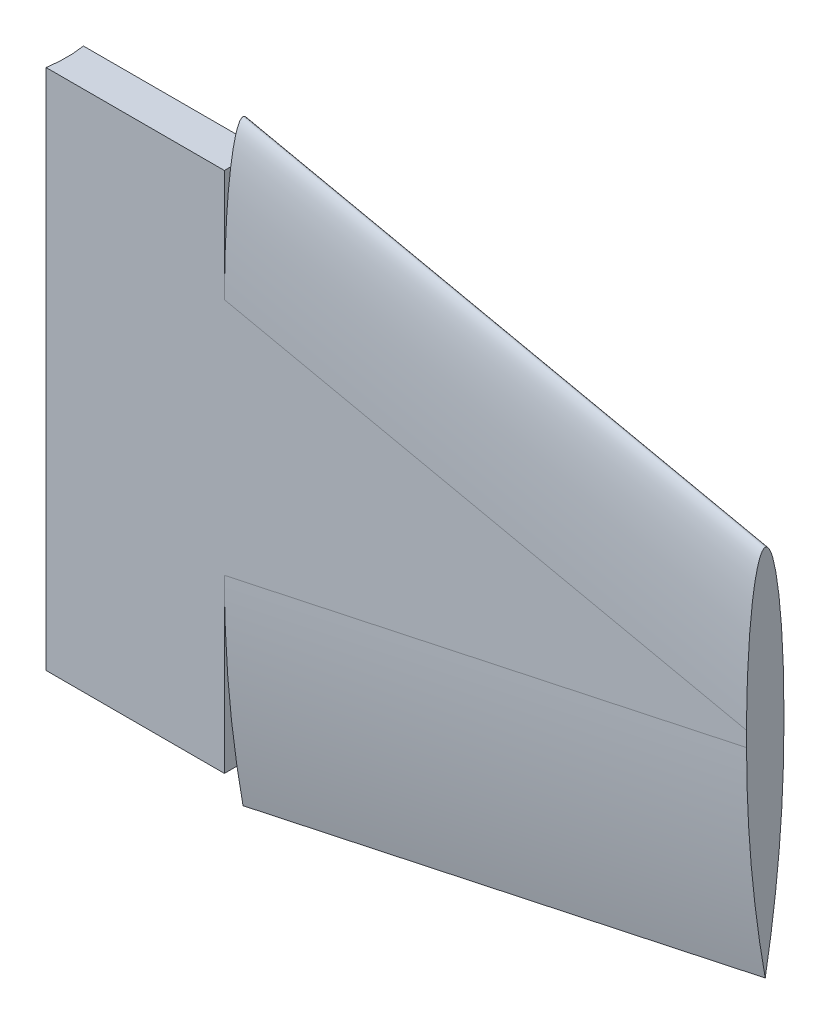
ISO-10303-21;
HEADER;
FILE_DESCRIPTION(('STEP AP214'),'2;1');
FILE_NAME('part.step','',(''),(''),'','','');
FILE_SCHEMA(('AUTOMOTIVE_DESIGN { 1 0 10303 214 1 1 1 1 }'));
ENDSEC;
DATA;
#1=APPLICATION_CONTEXT('core data for automotive mechanical design processes');
#2=APPLICATION_PROTOCOL_DEFINITION('international standard','automotive_design',2000,#1);
#3=PRODUCT_CONTEXT('',#1,'mechanical');
#4=PRODUCT('Part','Part','',(#3));
#5=PRODUCT_RELATED_PRODUCT_CATEGORY('part','',(#4));
#6=PRODUCT_DEFINITION_FORMATION('','',#4);
#7=PRODUCT_DEFINITION_CONTEXT('part definition',#1,'design');
#8=PRODUCT_DEFINITION('design','',#6,#7);
#9=PRODUCT_DEFINITION_SHAPE('','',#8);
#10=(LENGTH_UNIT() NAMED_UNIT(*) SI_UNIT(.MILLI.,.METRE.));
#11=(NAMED_UNIT(*) PLANE_ANGLE_UNIT() SI_UNIT($,.RADIAN.));
#12=(NAMED_UNIT(*) SI_UNIT($,.STERADIAN.) SOLID_ANGLE_UNIT());
#13=UNCERTAINTY_MEASURE_WITH_UNIT(LENGTH_MEASURE(1.E-05),#10,'distance_accuracy_value','');
#14=(GEOMETRIC_REPRESENTATION_CONTEXT(3) GLOBAL_UNCERTAINTY_ASSIGNED_CONTEXT((#13)) GLOBAL_UNIT_ASSIGNED_CONTEXT((#10,
#11,#12)) REPRESENTATION_CONTEXT('',''));
#15=CARTESIAN_POINT('',(0.,0.,0.));
#16=DIRECTION('',(0.,0.,1.));
#17=DIRECTION('',(1.,0.,0.));
#18=AXIS2_PLACEMENT_3D('',#15,#16,#17);
#19=CARTESIAN_POINT('',(95.,60.,5.));
#20=DIRECTION('',(-1.,0.,0.));
#21=DIRECTION('',(0.,0.,1.));
#22=AXIS2_PLACEMENT_3D('',#19,#20,#21);
#23=PLANE('',#22);
#24=CARTESIAN_POINT('',(95.,38.,-153.05));
#25=DIRECTION('',(1.,0.,0.));
#26=DIRECTION('',(0.,1.,0.));
#27=AXIS2_PLACEMENT_3D('',#24,#25,#26);
#28=CIRCLE('',#27,158.05);
#29=CARTESIAN_POINT('',(95.,38.,5.));
#30=VERTEX_POINT('',#29);
#31=CARTESIAN_POINT('',(95.,10.,2.5));
#32=VERTEX_POINT('',#31);
#33=EDGE_CURVE('E240',#30,#32,#28,.T.);
#34=ORIENTED_EDGE('',*,*,#33,.T.);
#35=CARTESIAN_POINT('',(95.,38.,158.05));
#36=DIRECTION('',(1.,0.,0.));
#37=DIRECTION('',(0.,1.,0.));
#38=AXIS2_PLACEMENT_3D('',#35,#36,#37);
#39=CIRCLE('',#38,158.05);
#40=CARTESIAN_POINT('',(95.,38.,0.));
#41=VERTEX_POINT('',#40);
#42=EDGE_CURVE('E152',#41,#32,#39,.F.);
#43=ORIENTED_EDGE('',*,*,#42,.F.);
#44=DIRECTION('',(0.,1.,0.));
#45=VECTOR('',#44,1.);
#46=CARTESIAN_POINT('',(95.,60.,0.));
#47=LINE('',#46,#45);
#48=CARTESIAN_POINT('',(95.,40.,0.));
#49=VERTEX_POINT('',#48);
#50=EDGE_CURVE('E160',#41,#49,#47,.T.);
#51=ORIENTED_EDGE('',*,*,#50,.T.);
#52=CARTESIAN_POINT('',(95.,40.,2.5));
#53=DIRECTION('',(1.,0.,0.));
#54=DIRECTION('',(0.,1.,0.));
#55=AXIS2_PLACEMENT_3D('',#52,#53,#54);
#56=ELLIPSE('',#55,20.,2.5);
#57=CARTESIAN_POINT('',(95.,40.,5.));
#58=VERTEX_POINT('',#57);
#59=EDGE_CURVE('E222',#49,#58,#56,.T.);
#60=ORIENTED_EDGE('',*,*,#59,.T.);
#61=DIRECTION('',(0.,1.,0.));
#62=VECTOR('',#61,1.);
#63=CARTESIAN_POINT('',(95.,60.,5.));
#64=LINE('',#63,#62);
#65=EDGE_CURVE('E162',#30,#58,#64,.T.);
#66=ORIENTED_EDGE('',*,*,#65,.F.);
#67=EDGE_LOOP('',(#34,#43,#51,#60,#66));
#68=FACE_BOUND('',#67,.T.);
#69=ADVANCED_FACE('F52',(#68),#23,.F.);
#70=CARTESIAN_POINT('',(25.,-5.,5.));
#71=DIRECTION('',(1.,0.,0.));
#72=DIRECTION('',(0.,1.,0.));
#73=AXIS2_PLACEMENT_3D('',#70,#71,#72);
#74=PLANE('',#73);
#75=DIRECTION('',(0.,0.,-1.));
#76=VECTOR('',#75,1.);
#77=CARTESIAN_POINT('',(25.,0.,5.));
#78=LINE('',#77,#76);
#79=CARTESIAN_POINT('',(25.,0.,3.31752380209902));
#80=VERTEX_POINT('',#79);
#81=CARTESIAN_POINT('',(25.,-2.79117007284668E-12,1.68247619790141));
#82=VERTEX_POINT('',#81);
#83=EDGE_CURVE('E60',#80,#82,#78,.T.);
#84=ORIENTED_EDGE('',*,*,#83,.T.);
#85=CARTESIAN_POINT('',(25.,-5.,2.5));
#86=CARTESIAN_POINT('',(25.,-4.22891004803133,2.36119838188935));
#87=CARTESIAN_POINT('',(25.,-3.45678786190338,2.22813131429508));
#88=CARTESIAN_POINT('',(25.,-1.91150037104142,1.97363373583211));
#89=CARTESIAN_POINT('',(25.,-1.13833714759861,1.85219058744662));
#90=CARTESIAN_POINT('',(25.,0.409027347301473,1.62090461061019));
#91=CARTESIAN_POINT('',(25.,1.18322710807492,1.51105167521599));
#92=CARTESIAN_POINT('',(25.,2.73266060465429,1.30291688823553));
#93=CARTESIAN_POINT('',(25.,3.50789332172647,1.20462745276201));
#94=CARTESIAN_POINT('',(25.,5.05938978757526,1.01959822513703));
#95=CARTESIAN_POINT('',(25.,5.83565293240375,0.932853368772302));
#96=CARTESIAN_POINT('',(25.,7.38920839583698,0.770899380919737));
#97=CARTESIAN_POINT('',(25.,8.16650044936275,0.695687706635616));
#98=CARTESIAN_POINT('',(25.,9.72211395689603,0.556793643463008));
#99=CARTESIAN_POINT('',(25.,10.5004354109035,0.493111254574523));
#100=CARTESIAN_POINT('',(25.,12.0581087041456,0.377276960581072));
#101=CARTESIAN_POINT('',(25.,12.8374607329737,0.325127605012163));
#102=CARTESIAN_POINT('',(25.,14.3971955867306,0.232368321958052));
#103=CARTESIAN_POINT('',(25.,15.177578714436,0.191763485576444));
#104=CARTESIAN_POINT('',(25.,16.7393765912369,0.12210975707657));
#105=CARTESIAN_POINT('',(25.,17.5207916812675,0.0930685093632958));
#106=CARTESIAN_POINT('',(25.,19.0846547279814,0.0465663128413747));
#107=CARTESIAN_POINT('',(25.,19.8671029884137,0.0291155787380201));
#108=CARTESIAN_POINT('',(25.,21.4330340317578,0.00582578807542668));
#109=CARTESIAN_POINT('',(25.,22.2165170051513,-4.62144755699006E-07));
#110=CARTESIAN_POINT('',(25.,23.,0.));
#111=B_SPLINE_CURVE_WITH_KNOTS('',3,(#85,#86,#87,#88,#89,#90,#91,#92,#93,#94,#95,#96,#97,#98,
#99,#100,#101,#102,#103,#104,#105,#106,#107,#108,#109,#110),.UNSPECIFIED.,.F.,.F.,(4,2,2,2,2,2,
2,2,2,2,2,2,4),(0.,2.35042727790173,4.69826943481805,7.04404699433685,9.38827740331911,
11.7314760648126,14.0741573608249,16.4168386568372,18.7600373183307,21.104267727313,
23.4500452868318,25.7978874437481,28.1483147216498),.UNSPECIFIED.);
#112=CARTESIAN_POINT('',(25.,-5.,2.5));
#113=VERTEX_POINT('',#112);
#114=EDGE_CURVE('E247',#113,#82,#111,.T.);
#115=ORIENTED_EDGE('',*,*,#114,.F.);
#116=CARTESIAN_POINT('',(25.,-4.99999999999999,2.5));
#117=CARTESIAN_POINT('',(25.,-4.22891004803133,2.63880161811067));
#118=CARTESIAN_POINT('',(25.,-3.45678786190338,2.77186868570494));
#119=CARTESIAN_POINT('',(25.,-1.91150037104141,3.02636626416792));
#120=CARTESIAN_POINT('',(25.,-1.1383371475986,3.14780941255339));
#121=CARTESIAN_POINT('',(25.,0.409027347301485,3.37909538938981));
#122=CARTESIAN_POINT('',(25.,1.18322710807493,3.48894832478401));
#123=CARTESIAN_POINT('',(25.,2.73266060465431,3.69708311176447));
#124=CARTESIAN_POINT('',(25.,3.50789332172649,3.795372547238));
#125=CARTESIAN_POINT('',(25.,5.05938978757527,3.98040177486297));
#126=CARTESIAN_POINT('',(25.,5.83565293240377,4.0671466312277));
#127=CARTESIAN_POINT('',(25.,7.389208395837,4.22910061908027));
#128=CARTESIAN_POINT('',(25.,8.16650044936276,4.30431229336439));
#129=CARTESIAN_POINT('',(25.,9.72211395689605,4.443206356537));
#130=CARTESIAN_POINT('',(25.,10.5004354109036,4.50688874542548));
#131=CARTESIAN_POINT('',(25.,12.0581087041456,4.62272303941892));
#132=CARTESIAN_POINT('',(25.,12.8374607329738,4.67487239498784));
#133=CARTESIAN_POINT('',(25.,14.3971955867307,4.76763167804195));
#134=CARTESIAN_POINT('',(25.,15.1775787144361,4.80823651442356));
#135=CARTESIAN_POINT('',(25.,16.7393765912369,4.87789024292343));
#136=CARTESIAN_POINT('',(25.,17.5207916812676,4.90693149063671));
#137=CARTESIAN_POINT('',(25.,19.0846547279815,4.95343368715863));
#138=CARTESIAN_POINT('',(25.,19.8671029884137,4.97088442126198));
#139=CARTESIAN_POINT('',(25.,21.4330340317579,4.99417421192458));
#140=CARTESIAN_POINT('',(25.,22.2165170051514,5.00000046214476));
#141=CARTESIAN_POINT('',(25.,23.,5.));
#142=B_SPLINE_CURVE_WITH_KNOTS('',3,(#116,#117,#118,#119,#120,#121,#122,#123,#124,#125,#126,
#127,#128,#129,#130,#131,#132,#133,#134,#135,#136,#137,#138,#139,#140,#141),.UNSPECIFIED.,.F.,
.F.,(4,2,2,2,2,2,2,2,2,2,2,2,4),(0.,2.35042727790174,4.69826943481806,7.04404699433686,
9.38827740331912,11.7314760648126,14.0741573608249,16.4168386568373,18.7600373183308,
21.104267727313,23.4500452868318,25.7978874437481,28.1483147216499),.UNSPECIFIED.);
#143=EDGE_CURVE('E254',#113,#80,#142,.T.);
#144=ORIENTED_EDGE('',*,*,#143,.T.);
#145=EDGE_LOOP('',(#84,#115,#144));
#146=FACE_BOUND('',#145,.T.);
#147=ADVANCED_FACE('F296',(#146),#74,.F.);
#148=CARTESIAN_POINT('',(25.,70.,5.));
#149=DIRECTION('',(1.,0.,0.));
#150=DIRECTION('',(0.,1.,0.));
#151=AXIS2_PLACEMENT_3D('',#148,#149,#150);
#152=PLANE('',#151);
#153=CARTESIAN_POINT('',(25.,55.,5.));
#154=CARTESIAN_POINT('',(25.,55.6100570971112,4.99996719193825));
#155=CARTESIAN_POINT('',(25.,56.2201167969391,4.99650921176124));
#156=CARTESIAN_POINT('',(25.,57.440177884873,4.98251278536062));
#157=CARTESIAN_POINT('',(25.,58.0501792698518,4.97197406802728));
#158=CARTESIAN_POINT('',(25.,59.2700169296486,4.94358593248582));
#159=CARTESIAN_POINT('',(25.,59.8798532035131,4.92573647291487));
#160=CARTESIAN_POINT('',(25.,61.0992400519951,4.88223137885396));
#161=CARTESIAN_POINT('',(25.,61.7087906312321,4.85657587527583));
#162=CARTESIAN_POINT('',(25.,62.9274974345676,4.79668083316584));
#163=CARTESIAN_POINT('',(25.,63.5366536417813,4.76244094869547));
#164=CARTESIAN_POINT('',(25.,64.7543779009708,4.68418376354576));
#165=CARTESIAN_POINT('',(25.,65.3629459265278,4.64016604247418));
#166=CARTESIAN_POINT('',(25.,66.2751443151161,4.56534893535719));
#167=CARTESIAN_POINT('',(25.,66.5791371528876,4.5389411956029));
#168=CARTESIAN_POINT('',(25.,67.1868177684382,4.48283427261292));
#169=CARTESIAN_POINT('',(25.,67.490505549517,4.45313512537478));
#170=CARTESIAN_POINT('',(25.,68.0974751439356,4.38999031987914));
#171=CARTESIAN_POINT('',(25.,68.4007569801746,4.35654488281176));
#172=CARTESIAN_POINT('',(25.,69.0068031091154,4.28528168916124));
#173=CARTESIAN_POINT('',(25.,69.3095674143278,4.247464039831));
#174=CARTESIAN_POINT('',(25.,69.9143854270388,4.16657082634898));
#175=CARTESIAN_POINT('',(25.,70.2164391615704,4.12349546562979));
#176=CARTESIAN_POINT('',(25.,70.8195541482979,4.03078515573143));
#177=CARTESIAN_POINT('',(25.,71.1206154080616,3.98115025668839));
#178=CARTESIAN_POINT('',(25.,71.6292555066511,3.88969609331526));
#179=CARTESIAN_POINT('',(25.,71.8372391715174,3.85013549817384));
#180=CARTESIAN_POINT('',(25.,72.252115932454,3.76566943397312));
#181=CARTESIAN_POINT('',(25.,72.4590091400108,3.72076452282831));
#182=CARTESIAN_POINT('',(25.,72.8053286027722,3.63921009637234));
#183=CARTESIAN_POINT('',(25.,72.945210310305,3.60450073734025));
#184=CARTESIAN_POINT('',(25.,73.2238732607419,3.53075903127375));
#185=CARTESIAN_POINT('',(25.,73.3626543328855,3.49172602697326));
#186=CARTESIAN_POINT('',(25.,73.5950513088215,3.42098403316814));
#187=CARTESIAN_POINT('',(25.,73.6891402170798,3.3908342740368));
#188=CARTESIAN_POINT('',(25.,73.8760519872633,3.32697835155567));
#189=CARTESIAN_POINT('',(25.,73.9688756989491,3.29327472304237));
#190=CARTESIAN_POINT('',(25.,74.1242844265109,3.23213593096584));
#191=CARTESIAN_POINT('',(25.,74.1873679674086,3.20597237707307));
#192=CARTESIAN_POINT('',(25.,74.3123320746899,3.15056905671851));
#193=CARTESIAN_POINT('',(25.,74.3742103112245,3.12132392115857));
#194=CARTESIAN_POINT('',(25.,74.4665222964685,3.07380484075676));
#195=CARTESIAN_POINT('',(25.,74.4977319733232,3.0570398855988));
#196=CARTESIAN_POINT('',(25.,74.5593926874627,3.02217433373097));
#197=CARTESIAN_POINT('',(25.,74.5898439092831,3.00407406624021));
#198=CARTESIAN_POINT('',(25.,74.6496370712184,2.96629258884342));
#199=CARTESIAN_POINT('',(25.,74.6789819099014,2.946616003685));
#200=CARTESIAN_POINT('',(25.,74.7362031304988,2.90524948704028));
#201=CARTESIAN_POINT('',(25.,74.7640807817225,2.88356134223557));
#202=CARTESIAN_POINT('',(25.,74.8126876805361,2.84187598113215));
#203=CARTESIAN_POINT('',(25.,74.8337837350528,2.82231128263778));
#204=CARTESIAN_POINT('',(25.,74.8739175922178,2.78104463735637));
#205=CARTESIAN_POINT('',(25.,74.8929506154655,2.75933794129225));
#206=CARTESIAN_POINT('',(25.,74.928134059523,2.71304349190787));
#207=CARTESIAN_POINT('',(25.,74.9442291833767,2.68841255456384));
#208=CARTESIAN_POINT('',(25.,74.9712354824057,2.63648383059207));
#209=CARTESIAN_POINT('',(25.,74.9821791655262,2.60920411465042));
#210=CARTESIAN_POINT('',(25.,74.9929300516406,2.56778343170071));
#211=CARTESIAN_POINT('',(25.,74.9955649118799,2.55436155683121));
#212=CARTESIAN_POINT('',(25.,74.999100468482,2.52729522636453));
#213=CARTESIAN_POINT('',(25.,75.0000021567772,2.51365090259217));
#214=CARTESIAN_POINT('',(25.,74.9999968806356,2.48025658801789));
#215=CARTESIAN_POINT('',(25.,74.9981030915235,2.46049941441228));
#216=CARTESIAN_POINT('',(25.,74.990783777299,2.42164689206323));
#217=CARTESIAN_POINT('',(25.,74.9853519467445,2.40255278915042));
#218=CARTESIAN_POINT('',(25.,74.9695541841972,2.3600333765652));
#219=CARTESIAN_POINT('',(25.,74.9582088307706,2.33697841679715));
#220=CARTESIAN_POINT('',(25.,74.9320668340334,2.29293062362906));
#221=CARTESIAN_POINT('',(25.,74.9172621912404,2.27194273264098));
#222=CARTESIAN_POINT('',(25.,74.8866034518594,2.23351738531976));
#223=CARTESIAN_POINT('',(25.,74.8709332505069,2.2159299743133));
#224=CARTESIAN_POINT('',(25.,74.8381525456892,2.18213946944723));
#225=CARTESIAN_POINT('',(25.,74.8210407187674,2.16593767573262));
#226=CARTESIAN_POINT('',(25.,74.7857257489314,2.13468704455279));
#227=CARTESIAN_POINT('',(25.,74.7675198883216,2.11964130929964));
#228=CARTESIAN_POINT('',(25.,74.7303247670051,2.09057759353092));
#229=CARTESIAN_POINT('',(25.,74.7113358475713,2.07655917253632));
#230=CARTESIAN_POINT('',(25.,74.6591092214754,2.03978483535939));
#231=CARTESIAN_POINT('',(25.,74.6252885383343,2.01785800890264));
#232=CARTESIAN_POINT('',(25.,74.556441653079,1.97597336895366));
#233=CARTESIAN_POINT('',(25.,74.5214147164047,1.95601678491646));
#234=CARTESIAN_POINT('',(25.,74.414932069478,1.89843004262513));
#235=CARTESIAN_POINT('',(25.,74.3422004514531,1.86316613886509));
#236=CARTESIAN_POINT('',(25.,74.1945107122808,1.79681353447809));
#237=CARTESIAN_POINT('',(25.,74.1195438123434,1.76574500578123));
#238=CARTESIAN_POINT('',(25.,73.9684528896012,1.70687719886343));
#239=CARTESIAN_POINT('',(25.,73.8923304170447,1.67907391419392));
#240=CARTESIAN_POINT('',(25.,73.7252263712684,1.62110475736306));
#241=CARTESIAN_POINT('',(25.,73.6340736081855,1.59143689059189));
#242=CARTESIAN_POINT('',(25.,73.4509265184294,1.53480199551869));
#243=CARTESIAN_POINT('',(25.,73.3589320735797,1.50783535303636));
#244=CARTESIAN_POINT('',(25.,73.1742609958387,1.45606158229226));
#245=CARTESIAN_POINT('',(25.,73.0815838732991,1.43125621033313));
#246=CARTESIAN_POINT('',(25.,72.8957620698813,1.38345712771971));
#247=CARTESIAN_POINT('',(25.,72.8026173686588,1.36046349663377));
#248=CARTESIAN_POINT('',(25.,72.5232538174978,1.29391766084962));
#249=CARTESIAN_POINT('',(25.,72.3364943080006,1.25263367256103));
#250=CARTESIAN_POINT('',(25.,71.9621084352356,1.17465542010939));
#251=CARTESIAN_POINT('',(25.,71.7744824226245,1.13795944366916));
#252=CARTESIAN_POINT('',(25.,71.3991364462781,1.06832268138205));
#253=CARTESIAN_POINT('',(25.,71.2114185559125,1.0353706660754));
#254=CARTESIAN_POINT('',(25.,70.8354677152791,0.972459656412377));
#255=CARTESIAN_POINT('',(25.,70.6472347180998,0.942500944657877));
#256=CARTESIAN_POINT('',(25.,70.0818113359135,0.856386535700733));
#257=CARTESIAN_POINT('',(25.,69.7040432380805,0.804018940098117));
#258=CARTESIAN_POINT('',(25.,68.9476066160576,0.706973856030569));
#259=CARTESIAN_POINT('',(25.,68.5689382560225,0.662295060531573));
#260=CARTESIAN_POINT('',(25.,67.8109065112351,0.579165100712073));
#261=CARTESIAN_POINT('',(25.,67.4315430975502,0.540714201879654));
#262=CARTESIAN_POINT('',(25.,66.6723497244796,0.469058770475003));
#263=CARTESIAN_POINT('',(25.,66.2925197961621,0.435853905800114));
#264=CARTESIAN_POINT('',(25.,65.5324884609669,0.373999515293144));
#265=CARTESIAN_POINT('',(25.,65.1522870511175,0.345350026207685));
#266=CARTESIAN_POINT('',(25.,64.3657306905758,0.290291724254048));
#267=CARTESIAN_POINT('',(25.,63.9593558641587,0.264167875958922));
#268=CARTESIAN_POINT('',(25.,63.1463598873753,0.216093316902252));
#269=CARTESIAN_POINT('',(25.,62.7397387358153,0.194142626530254));
#270=CARTESIAN_POINT('',(25.,61.519609417156,0.134026895747251));
#271=CARTESIAN_POINT('',(25.,60.705814861066,0.101596797182248));
#272=CARTESIAN_POINT('',(25.,59.0767549229191,0.050237753241242));
#273=CARTESIAN_POINT('',(25.,58.261489001157,0.0313263518014411));
#274=CARTESIAN_POINT('',(25.,57.0384736275857,0.0124907634284814));
#275=CARTESIAN_POINT('',(25.,56.6307923981601,0.00780081775834986));
#276=CARTESIAN_POINT('',(25.,55.8154078894044,0.00155777782920903));
#277=CARTESIAN_POINT('',(25.,55.4077046101936,4.66803686648456E-06));
#278=CARTESIAN_POINT('',(25.,55.,0.));
#279=B_SPLINE_CURVE_WITH_KNOTS('',3,(#153,#154,#155,#156,#157,#158,#159,#160,#161,#162,#163,
#164,#165,#166,#167,#168,#169,#170,#171,#172,#173,#174,#175,#176,#177,#178,#179,#180,#181,#182,
#183,#184,#185,#186,#187,#188,#189,#190,#191,#192,#193,#194,#195,#196,#197,#198,#199,#200,#201,
#202,#203,#204,#205,#206,#207,#208,#209,#210,#211,#212,#213,#214,#215,#216,#217,#218,#219,#220,
#221,#222,#223,#224,#225,#226,#227,#228,#229,#230,#231,#232,#233,#234,#235,#236,#237,#238,#239,
#240,#241,#242,#243,#244,#245,#246,#247,#248,#249,#250,#251,#252,#253,#254,#255,#256,#257,#258,
#259,#260,#261,#262,#263,#264,#265,#266,#267,#268,#269,#270,#271,#272,#273,#274,#275,#276,#277,
#278),.UNSPECIFIED.,.F.,.F.,(4,2,2,2,2,2,2,2,2,2,2,2,2,2,2,2,2,2,2,2,2,2,2,2,2,2,2,2,2,2,2,2,2,
2,2,2,2,2,2,2,2,2,2,2,2,2,2,2,2,2,2,2,2,2,2,2,2,2,2,2,2,2,4),(0.,1.83016571856656,
3.66040151515534,5.49064766702708,7.32086312631316,9.15115235257369,10.9815202862609,
11.8969192109733,12.8123081251116,13.7276430209046,14.6429554677655,15.5582325103663,
16.47350255769,17.1085928962422,17.7436169932387,18.1759420734702,18.6083329647421,
18.9046900277927,19.2008371227083,19.405668093431,19.6108620385447,19.7171196638381,
19.8233511784781,19.9292816971472,20.035119012514,20.1213253285565,20.2077272714266,
20.2956174149738,20.3829452393978,20.4238802008911,20.464791727422,20.5239624025962,
20.5832388204253,20.6598848176106,20.7367098413443,20.8072729908397,20.8779016405013,
20.9487136392974,21.0194950963749,21.1403152446063,21.2612103157534,21.5034514686691,
21.7468187600841,21.9898842494547,22.2774075301888,22.5649718198994,22.8527676535129,
23.140576119556,23.7142933631612,24.2877958483746,24.8595300631792,25.4313182052886,
26.5753414177044,27.7191699628757,28.8630472553191,30.0068521050322,31.1506661809512,
32.3722826023359,33.5939049922373,36.0370880647571,38.4834360586908,39.7065502007075,
40.9296582859566),.UNSPECIFIED.);
#280=CARTESIAN_POINT('',(25.,70.,4.15359456941537));
#281=VERTEX_POINT('',#280);
#282=CARTESIAN_POINT('',(25.,70.,0.846405430584635));
#283=VERTEX_POINT('',#282);
#284=EDGE_CURVE('E177',#281,#283,#279,.T.);
#285=ORIENTED_EDGE('',*,*,#284,.T.);
#286=DIRECTION('',(0.,0.,-1.));
#287=VECTOR('',#286,1.);
#288=CARTESIAN_POINT('',(25.,70.,5.));
#289=LINE('',#288,#287);
#290=EDGE_CURVE('E166',#281,#283,#289,.T.);
#291=ORIENTED_EDGE('',*,*,#290,.F.);
#292=EDGE_LOOP('',(#285,#291));
#293=FACE_BOUND('',#292,.T.);
#294=ADVANCED_FACE('F308',(#293),#152,.F.);
#295=CARTESIAN_POINT('',(0.,0.,0.));
#296=DIRECTION('',(0.,0.,-1.));
#297=DIRECTION('',(-1.,0.,0.));
#298=AXIS2_PLACEMENT_3D('',#295,#296,#297);
#299=PLANE('',#298);
#300=DIRECTION('',(0.,1.,0.));
#301=VECTOR('',#300,1.);
#302=CARTESIAN_POINT('',(1.10222914111242,-5.,0.));
#303=LINE('',#302,#301);
#304=CARTESIAN_POINT('',(1.10222914111242,70.,0.));
#305=VERTEX_POINT('',#304);
#306=CARTESIAN_POINT('',(1.10222914111242,0.,0.));
#307=VERTEX_POINT('',#306);
#308=EDGE_CURVE('E136',#305,#307,#303,.F.);
#309=ORIENTED_EDGE('',*,*,#308,.F.);
#310=DIRECTION('',(-1.,0.,0.));
#311=VECTOR('',#310,1.);
#312=CARTESIAN_POINT('',(0.,70.,0.));
#313=LINE('',#312,#311);
#314=CARTESIAN_POINT('',(25.,70.,0.));
#315=VERTEX_POINT('',#314);
#316=EDGE_CURVE('E149',#315,#305,#313,.T.);
#317=ORIENTED_EDGE('',*,*,#316,.F.);
#318=DIRECTION('',(0.,-1.,0.));
#319=VECTOR('',#318,1.);
#320=CARTESIAN_POINT('',(24.9999999999999,19.2711302243301,0.));
#321=LINE('',#320,#319);
#322=CARTESIAN_POINT('',(25.,55.,0.));
#323=VERTEX_POINT('',#322);
#324=EDGE_CURVE('E216',#315,#323,#321,.T.);
#325=ORIENTED_EDGE('',*,*,#324,.T.);
#326=DIRECTION('',(0.97780241407741,-0.209529088730873,0.));
#327=VECTOR('',#326,1.);
#328=CARTESIAN_POINT('',(5.06805895312604,59.2711302243301,0.));
#329=LINE('',#328,#327);
#330=EDGE_CURVE('E217',#323,#49,#329,.T.);
#331=ORIENTED_EDGE('',*,*,#330,.T.);
#332=ORIENTED_EDGE('',*,*,#50,.F.);
#333=DIRECTION('',(0.977802414077409,0.209529088730874,0.));
#334=VECTOR('',#333,1.);
#335=CARTESIAN_POINT('',(-2.79938314518115,17.0429893260326,0.));
#336=LINE('',#335,#334);
#337=CARTESIAN_POINT('',(25.,23.,0.));
#338=VERTEX_POINT('',#337);
#339=EDGE_CURVE('E281',#338,#41,#336,.T.);
#340=ORIENTED_EDGE('',*,*,#339,.F.);
#341=DIRECTION('',(0.,-1.,0.));
#342=VECTOR('',#341,1.);
#343=CARTESIAN_POINT('',(25.,-20.9570106739673,0.));
#344=LINE('',#343,#342);
#345=CARTESIAN_POINT('',(25.,0.,0.));
#346=VERTEX_POINT('',#345);
#347=EDGE_CURVE('E279',#338,#346,#344,.T.);
#348=ORIENTED_EDGE('',*,*,#347,.T.);
#349=DIRECTION('',(1.,0.,0.));
#350=VECTOR('',#349,1.);
#351=CARTESIAN_POINT('',(25.,0.,0.));
#352=LINE('',#351,#350);
#353=EDGE_CURVE('E151',#307,#346,#352,.T.);
#354=ORIENTED_EDGE('',*,*,#353,.F.);
#355=EDGE_LOOP('',(#309,#317,#325,#331,#332,#340,#348,#354));
#356=FACE_BOUND('',#355,.T.);
#357=ADVANCED_FACE('F147',(#356),#299,.T.);
#358=CARTESIAN_POINT('',(0.,0.,5.));
#359=DIRECTION('',(0.,0.,-1.));
#360=DIRECTION('',(-1.,0.,0.));
#361=AXIS2_PLACEMENT_3D('',#358,#359,#360);
#362=PLANE('',#361);
#363=DIRECTION('',(-1.,0.,0.));
#364=VECTOR('',#363,1.);
#365=CARTESIAN_POINT('',(0.,70.,5.));
#366=LINE('',#365,#364);
#367=CARTESIAN_POINT('',(25.,70.,5.));
#368=VERTEX_POINT('',#367);
#369=CARTESIAN_POINT('',(1.10222914111242,70.,5.));
#370=VERTEX_POINT('',#369);
#371=EDGE_CURVE('E168',#368,#370,#366,.T.);
#372=ORIENTED_EDGE('',*,*,#371,.T.);
#373=DIRECTION('',(0.,1.,0.));
#374=VECTOR('',#373,1.);
#375=CARTESIAN_POINT('',(1.10222914111242,-5.,5.));
#376=LINE('',#375,#374);
#377=CARTESIAN_POINT('',(1.10222914111242,0.,5.));
#378=VERTEX_POINT('',#377);
#379=EDGE_CURVE('E67',#370,#378,#376,.F.);
#380=ORIENTED_EDGE('',*,*,#379,.T.);
#381=DIRECTION('',(1.,0.,0.));
#382=VECTOR('',#381,1.);
#383=CARTESIAN_POINT('',(25.,0.,5.));
#384=LINE('',#383,#382);
#385=CARTESIAN_POINT('',(25.,0.,5.));
#386=VERTEX_POINT('',#385);
#387=EDGE_CURVE('E159',#378,#386,#384,.T.);
#388=ORIENTED_EDGE('',*,*,#387,.T.);
#389=DIRECTION('',(0.,1.,0.));
#390=VECTOR('',#389,1.);
#391=CARTESIAN_POINT('',(25.,-20.9570106739673,5.));
#392=LINE('',#391,#390);
#393=CARTESIAN_POINT('',(25.,23.,5.));
#394=VERTEX_POINT('',#393);
#395=EDGE_CURVE('E218',#386,#394,#392,.T.);
#396=ORIENTED_EDGE('',*,*,#395,.T.);
#397=DIRECTION('',(0.977802414077409,0.209529088730874,0.));
#398=VECTOR('',#397,1.);
#399=CARTESIAN_POINT('',(-2.79938314518115,17.0429893260326,5.));
#400=LINE('',#399,#398);
#401=EDGE_CURVE('E237',#394,#30,#400,.T.);
#402=ORIENTED_EDGE('',*,*,#401,.T.);
#403=ORIENTED_EDGE('',*,*,#65,.T.);
#404=DIRECTION('',(0.97780241407741,-0.209529088730873,0.));
#405=VECTOR('',#404,1.);
#406=CARTESIAN_POINT('',(5.06805895312604,59.2711302243301,5.));
#407=LINE('',#406,#405);
#408=CARTESIAN_POINT('',(25.,55.,5.));
#409=VERTEX_POINT('',#408);
#410=EDGE_CURVE('E225',#409,#58,#407,.T.);
#411=ORIENTED_EDGE('',*,*,#410,.F.);
#412=DIRECTION('',(0.,1.,0.));
#413=VECTOR('',#412,1.);
#414=CARTESIAN_POINT('',(24.9999999999999,19.2711302243301,5.));
#415=LINE('',#414,#413);
#416=EDGE_CURVE('E179',#409,#368,#415,.T.);
#417=ORIENTED_EDGE('',*,*,#416,.T.);
#418=EDGE_LOOP('',(#372,#380,#388,#396,#402,#403,#411,#417));
#419=FACE_BOUND('',#418,.T.);
#420=ADVANCED_FACE('F233',(#419),#362,.F.);
#421=CARTESIAN_POINT('',(25.,0.,5.));
#422=DIRECTION('',(0.,1.,0.));
#423=DIRECTION('',(-1.,0.,0.));
#424=AXIS2_PLACEMENT_3D('',#421,#422,#423);
#425=PLANE('',#424);
#426=ORIENTED_EDGE('',*,*,#387,.F.);
#427=CARTESIAN_POINT('',(-14.6,0.,2.5));
#428=DIRECTION('',(0.,1.,0.));
#429=DIRECTION('',(-1.,0.,0.));
#430=AXIS2_PLACEMENT_3D('',#427,#428,#429);
#431=CIRCLE('',#430,15.9);
#432=EDGE_CURVE('E142',#378,#307,#431,.T.);
#433=ORIENTED_EDGE('',*,*,#432,.T.);
#434=ORIENTED_EDGE('',*,*,#353,.T.);
#435=DIRECTION('',(0.,0.,-1.));
#436=VECTOR('',#435,1.);
#437=CARTESIAN_POINT('',(25.,0.,5.));
#438=LINE('',#437,#436);
#439=EDGE_CURVE('E244',#82,#346,#438,.T.);
#440=ORIENTED_EDGE('',*,*,#439,.F.);
#441=ORIENTED_EDGE('',*,*,#83,.F.);
#442=EDGE_CURVE('E12',#386,#80,#78,.T.);
#443=ORIENTED_EDGE('',*,*,#442,.F.);
#444=EDGE_LOOP('',(#426,#433,#434,#440,#441,#443));
#445=FACE_BOUND('',#444,.T.);
#446=ADVANCED_FACE('F54',(#445),#425,.F.);
#447=CARTESIAN_POINT('',(0.,70.,5.));
#448=DIRECTION('',(0.,-1.,0.));
#449=DIRECTION('',(0.,0.,-1.));
#450=AXIS2_PLACEMENT_3D('',#447,#448,#449);
#451=PLANE('',#450);
#452=ORIENTED_EDGE('',*,*,#316,.T.);
#453=CARTESIAN_POINT('',(-14.6,70.,2.5));
#454=DIRECTION('',(0.,1.,0.));
#455=DIRECTION('',(0.,0.,1.));
#456=AXIS2_PLACEMENT_3D('',#453,#454,#455);
#457=CIRCLE('',#456,15.9);
#458=EDGE_CURVE('E133',#370,#305,#457,.T.);
#459=ORIENTED_EDGE('',*,*,#458,.F.);
#460=ORIENTED_EDGE('',*,*,#371,.F.);
#461=EDGE_CURVE('E75',#368,#281,#289,.T.);
#462=ORIENTED_EDGE('',*,*,#461,.T.);
#463=ORIENTED_EDGE('',*,*,#290,.T.);
#464=DIRECTION('',(0.,0.,1.));
#465=VECTOR('',#464,1.);
#466=CARTESIAN_POINT('',(25.,70.,5.));
#467=LINE('',#466,#465);
#468=EDGE_CURVE('E158',#315,#283,#467,.T.);
#469=ORIENTED_EDGE('',*,*,#468,.F.);
#470=EDGE_LOOP('',(#452,#459,#460,#462,#463,#469));
#471=FACE_BOUND('',#470,.T.);
#472=ADVANCED_FACE('F155',(#471),#451,.F.);
#473=CARTESIAN_POINT('',(25.,70.,5.));
#474=DIRECTION('',(1.,0.,0.));
#475=DIRECTION('',(0.,1.,0.));
#476=AXIS2_PLACEMENT_3D('',#473,#474,#475);
#477=PLANE('',#476);
#478=ORIENTED_EDGE('',*,*,#461,.F.);
#479=ORIENTED_EDGE('',*,*,#416,.F.);
#480=EDGE_CURVE('E173',#409,#281,#279,.T.);
#481=ORIENTED_EDGE('',*,*,#480,.T.);
#482=EDGE_LOOP('',(#478,#479,#481));
#483=FACE_BOUND('',#482,.T.);
#484=ADVANCED_FACE('F194',(#483),#477,.T.);
#485=CARTESIAN_POINT('',(5.06805895312604,59.2711302243301,2.5));
#486=DIRECTION('',(1.,0.,0.));
#487=DIRECTION('',(0.,1.,0.));
#488=AXIS2_PLACEMENT_3D('',#485,#486,#487);
#489=ELLIPSE('',#488,20.,2.5);
#490=DIRECTION('',(0.97780241407741,-0.209529088730873,0.));
#491=VECTOR('',#490,1.);
#492=SURFACE_OF_LINEAR_EXTRUSION('',#489,#491);
#493=ORIENTED_EDGE('',*,*,#410,.T.);
#494=ORIENTED_EDGE('',*,*,#59,.F.);
#495=ORIENTED_EDGE('',*,*,#330,.F.);
#496=CARTESIAN_POINT('',(25.,75.,2.5));
#497=CARTESIAN_POINT('',(25.,75.0000040661143,2.49003268405163));
#498=CARTESIAN_POINT('',(25.,74.9995227782081,2.4800715636625));
#499=CARTESIAN_POINT('',(25.,74.9976281791993,2.46025282829808));
#500=CARTESIAN_POINT('',(25.,74.9962162541439,2.45039508150999));
#501=CARTESIAN_POINT('',(25.,74.9906943937882,2.4213539176568));
#502=CARTESIAN_POINT('',(25.,74.9852959034497,2.40240778285641));
#503=CARTESIAN_POINT('',(25.,74.969572843249,2.36007600855475));
#504=CARTESIAN_POINT('',(25.,74.9582547984077,2.3370699260363));
#505=CARTESIAN_POINT('',(25.,74.9321264671256,2.29301696284075));
#506=CARTESIAN_POINT('',(25.,74.9172943616763,2.27198351778284));
#507=CARTESIAN_POINT('',(25.,74.8865963003344,2.23350799555452));
#508=CARTESIAN_POINT('',(25.,74.8709180071945,2.21591274372352));
#509=CARTESIAN_POINT('',(25.,74.8381199596093,2.18210740089016));
#510=CARTESIAN_POINT('',(25.,74.8209988807973,2.16589861066307));
#511=CARTESIAN_POINT('',(25.,74.7856818332296,2.13465023353283));
#512=CARTESIAN_POINT('',(25.,74.7674841640515,2.11961258811166));
#513=CARTESIAN_POINT('',(25.,74.7303063128863,2.0905639795904));
#514=CARTESIAN_POINT('',(25.,74.711326473291,2.07655257456352));
#515=CARTESIAN_POINT('',(25.,74.6591118822945,2.03978670424355));
#516=CARTESIAN_POINT('',(25.,74.6252939989653,2.01786155118882));
#517=CARTESIAN_POINT('',(25.,74.5564528737362,1.97597997663677));
#518=CARTESIAN_POINT('',(25.,74.5214288975246,1.95602478416196));
#519=CARTESIAN_POINT('',(25.,74.4149552010933,1.89844188313655));
#520=CARTESIAN_POINT('',(25.,74.3422297071501,1.86318013926495));
#521=CARTESIAN_POINT('',(25.,74.1945405625156,1.79682609441673));
#522=CARTESIAN_POINT('',(25.,74.1195678299315,1.76575466118227));
#523=CARTESIAN_POINT('',(25.,73.9684650352242,1.70688163410466));
#524=CARTESIAN_POINT('',(25.,73.892336523887,1.67907603243936));
#525=CARTESIAN_POINT('',(25.,73.725226307172,1.62110473541872));
#526=CARTESIAN_POINT('',(25.,73.6340734796331,1.59143684880332));
#527=CARTESIAN_POINT('',(25.,73.4509262600205,1.53480191764105));
#528=CARTESIAN_POINT('',(25.,73.3589317497724,1.50783525890649));
#529=CARTESIAN_POINT('',(25.,73.1742605381396,1.45606145732314));
#530=CARTESIAN_POINT('',(25.,73.0815833470897,1.43125607083836));
#531=CARTESIAN_POINT('',(25.,72.8957614062269,1.3834569611324));
#532=CARTESIAN_POINT('',(25.,72.8026166360697,1.36046331747942));
#533=CARTESIAN_POINT('',(25.,72.5232531467249,1.29391751039757));
#534=CARTESIAN_POINT('',(25.,72.3364937696324,1.25263355694894));
#535=CARTESIAN_POINT('',(25.,71.9621081644301,1.17465536716431));
#536=CARTESIAN_POINT('',(25.,71.7744822869827,1.13795941852301));
#537=CARTESIAN_POINT('',(25.,71.3991358227374,1.06832256567951));
#538=CARTESIAN_POINT('',(25.,71.2114173065959,1.03537044671332));
#539=CARTESIAN_POINT('',(25.,70.8354652111605,0.972459247645973));
#540=CARTESIAN_POINT('',(25.,70.6472315849537,0.942500450154685));
#541=CARTESIAN_POINT('',(25.,70.0818088218793,0.856386187719811));
#542=CARTESIAN_POINT('',(25.,69.7040419795265,0.804018778753065));
#543=CARTESIAN_POINT('',(25.,68.9476073242341,0.706973946766367));
#544=CARTESIAN_POINT('',(25.,68.5689396740451,0.66229522789224));
#545=CARTESIAN_POINT('',(25.,67.8109093510138,0.579165400288694));
#546=CARTESIAN_POINT('',(25.,67.4315466492389,0.540714557048046));
#547=CARTESIAN_POINT('',(25.,66.6723532798851,0.469059086124048));
#548=CARTESIAN_POINT('',(25.,66.2925226415377,0.435854145972118));
#549=CARTESIAN_POINT('',(25.,65.5324898847059,0.373999622563767));
#550=CARTESIAN_POINT('',(25.,65.1522877632497,0.345350076054539));
#551=CARTESIAN_POINT('',(25.,64.3657303478266,0.290291700263823));
#552=CARTESIAN_POINT('',(25.,63.9593551783925,0.26416783186758));
#553=CARTESIAN_POINT('',(25.,63.1463585152416,0.216093239298756));
#554=CARTESIAN_POINT('',(25.,62.739737020331,0.194142535515503));
#555=CARTESIAN_POINT('',(25.,61.5196080438567,0.134026841119098));
#556=CARTESIAN_POINT('',(25.,60.7058141742457,0.101596775538607));
#557=CARTESIAN_POINT('',(25.,59.0767557353487,0.0502377788449285));
#558=CARTESIAN_POINT('',(25.,58.2614906264223,0.0313263895621502));
#559=CARTESIAN_POINT('',(25.,57.0384756594889,0.0124907883680711));
#560=CARTESIAN_POINT('',(25.,56.6307940237307,0.00780083332337134));
#561=CARTESIAN_POINT('',(25.,55.8154087022286,0.00155778093915738));
#562=CARTESIAN_POINT('',(25.,55.407705016604,4.66806636182802E-06));
#563=CARTESIAN_POINT('',(25.,55.,0.));
#564=B_SPLINE_CURVE_WITH_KNOTS('',3,(#496,#497,#498,#499,#500,#501,#502,#503,#504,#505,#506,
#507,#508,#509,#510,#511,#512,#513,#514,#515,#516,#517,#518,#519,#520,#521,#522,#523,#524,#525,
#526,#527,#528,#529,#530,#531,#532,#533,#534,#535,#536,#537,#538,#539,#540,#541,#542,#543,#544,
#545,#546,#547,#548,#549,#550,#551,#552,#553,#554,#555,#556,#557,#558,#559,#560,#561,#562,#563),
.UNSPECIFIED.,.F.,.F.,(4,2,2,2,2,2,2,2,2,2,2,2,2,2,2,2,2,2,2,2,2,2,2,2,2,2,2,2,2,2,2,2,2,4),(0.,
0.0298791828616952,0.0597139653214738,0.118512912373237,0.195004509516284,0.271984104803452,
0.342581557427655,0.413244534111094,0.484022264408946,0.554769334491665,0.675579727970141,
0.796465022737108,1.03868685674127,1.28207361136286,1.52515849042724,1.81268197379118,
2.10024646531822,2.38804250874157,2.67585118456896,3.2495680180237,3.82307008937348,
4.39480620669385,4.96659625270006,6.11061565887887,7.25444206243691,8.39831721346574,
9.54212420465498,10.6859404221737,11.9075578743026,13.1291812948806,15.5723623060377,
18.0187078615997,19.2418232228186,20.4649325272962),.UNSPECIFIED.);
#565=EDGE_CURVE('E209',#283,#323,#564,.T.);
#566=ORIENTED_EDGE('',*,*,#565,.F.);
#567=ORIENTED_EDGE('',*,*,#284,.F.);
#568=ORIENTED_EDGE('',*,*,#480,.F.);
#569=EDGE_LOOP('',(#493,#494,#495,#566,#567,#568));
#570=FACE_BOUND('',#569,.T.);
#571=ADVANCED_FACE('F191',(#570),#492,.T.);
#572=CARTESIAN_POINT('',(25.,70.,5.));
#573=DIRECTION('',(1.,0.,0.));
#574=DIRECTION('',(0.,1.,0.));
#575=AXIS2_PLACEMENT_3D('',#572,#573,#574);
#576=PLANE('',#575);
#577=ORIENTED_EDGE('',*,*,#468,.T.);
#578=ORIENTED_EDGE('',*,*,#565,.T.);
#579=ORIENTED_EDGE('',*,*,#324,.F.);
#580=EDGE_LOOP('',(#577,#578,#579));
#581=FACE_BOUND('',#580,.T.);
#582=ADVANCED_FACE('F198',(#581),#576,.T.);
#583=CARTESIAN_POINT('',(25.,-5.,5.));
#584=DIRECTION('',(1.,0.,0.));
#585=DIRECTION('',(0.,1.,0.));
#586=AXIS2_PLACEMENT_3D('',#583,#584,#585);
#587=PLANE('',#586);
#588=ORIENTED_EDGE('',*,*,#442,.T.);
#589=EDGE_CURVE('E252',#80,#394,#142,.T.);
#590=ORIENTED_EDGE('',*,*,#589,.T.);
#591=ORIENTED_EDGE('',*,*,#395,.F.);
#592=EDGE_LOOP('',(#588,#590,#591));
#593=FACE_BOUND('',#592,.T.);
#594=ADVANCED_FACE('F202',(#593),#587,.T.);
#595=CARTESIAN_POINT('',(-2.79938314518115,17.0429893260326,-153.05));
#596=DIRECTION('',(1.,0.,0.));
#597=DIRECTION('',(0.,1.,0.));
#598=AXIS2_PLACEMENT_3D('',#595,#596,#597);
#599=CIRCLE('',#598,158.05);
#600=DIRECTION('',(0.977802414077409,0.209529088730874,0.));
#601=VECTOR('',#600,1.);
#602=SURFACE_OF_LINEAR_EXTRUSION('',#599,#601);
#603=DIRECTION('',(0.977802414077409,0.209529088730874,0.));
#604=VECTOR('',#603,1.);
#605=CARTESIAN_POINT('',(-2.79938314518113,-10.9570106739674,2.5));
#606=LINE('',#605,#604);
#607=EDGE_CURVE('E246',#113,#32,#606,.T.);
#608=ORIENTED_EDGE('',*,*,#607,.T.);
#609=ORIENTED_EDGE('',*,*,#33,.F.);
#610=ORIENTED_EDGE('',*,*,#401,.F.);
#611=ORIENTED_EDGE('',*,*,#589,.F.);
#612=ORIENTED_EDGE('',*,*,#143,.F.);
#613=EDGE_LOOP('',(#608,#609,#610,#611,#612));
#614=FACE_BOUND('',#613,.T.);
#615=ADVANCED_FACE('F204',(#614),#602,.T.);
#616=CARTESIAN_POINT('',(25.,-5.,5.));
#617=DIRECTION('',(1.,0.,0.));
#618=DIRECTION('',(0.,1.,0.));
#619=AXIS2_PLACEMENT_3D('',#616,#617,#618);
#620=PLANE('',#619);
#621=ORIENTED_EDGE('',*,*,#439,.T.);
#622=ORIENTED_EDGE('',*,*,#347,.F.);
#623=EDGE_CURVE('E287',#82,#338,#111,.T.);
#624=ORIENTED_EDGE('',*,*,#623,.F.);
#625=EDGE_LOOP('',(#621,#622,#624));
#626=FACE_BOUND('',#625,.T.);
#627=ADVANCED_FACE('F272',(#626),#620,.T.);
#628=CARTESIAN_POINT('',(-2.79938314518115,17.0429893260326,158.05));
#629=DIRECTION('',(1.,0.,0.));
#630=DIRECTION('',(0.,1.,0.));
#631=AXIS2_PLACEMENT_3D('',#628,#629,#630);
#632=CIRCLE('',#631,158.05);
#633=DIRECTION('',(0.977802414077409,0.209529088730874,0.));
#634=VECTOR('',#633,1.);
#635=SURFACE_OF_LINEAR_EXTRUSION('',#632,#634);
#636=ORIENTED_EDGE('',*,*,#114,.T.);
#637=ORIENTED_EDGE('',*,*,#623,.T.);
#638=ORIENTED_EDGE('',*,*,#339,.T.);
#639=ORIENTED_EDGE('',*,*,#42,.T.);
#640=ORIENTED_EDGE('',*,*,#607,.F.);
#641=EDGE_LOOP('',(#636,#637,#638,#639,#640));
#642=FACE_BOUND('',#641,.T.);
#643=ADVANCED_FACE('F267',(#642),#635,.T.);
#644=CARTESIAN_POINT('',(-14.6,-5.,2.5));
#645=DIRECTION('',(0.,1.,0.));
#646=DIRECTION('',(0.,0.,1.));
#647=AXIS2_PLACEMENT_3D('',#644,#645,#646);
#648=CYLINDRICAL_SURFACE('',#647,15.9);
#649=ORIENTED_EDGE('',*,*,#308,.T.);
#650=ORIENTED_EDGE('',*,*,#432,.F.);
#651=ORIENTED_EDGE('',*,*,#379,.F.);
#652=ORIENTED_EDGE('',*,*,#458,.T.);
#653=EDGE_LOOP('',(#649,#650,#651,#652));
#654=FACE_BOUND('',#653,.T.);
#655=ADVANCED_FACE('F135',(#654),#648,.F.);
#656=CLOSED_SHELL('',(#69,#147,#294,#357,#420,#446,#472,#484,#571,#582,#594,#615,#627,#643,#655));
#657=MANIFOLD_SOLID_BREP('B2',#656);
#658=ADVANCED_BREP_SHAPE_REPRESENTATION('',(#18,#657),#14);
#659=SHAPE_DEFINITION_REPRESENTATION(#9,#658);
ENDSEC;
END-ISO-10303-21;
